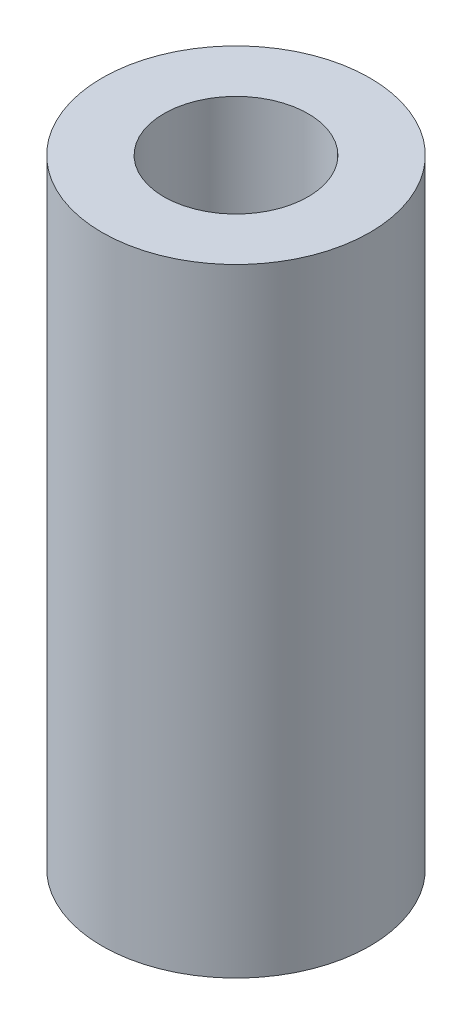
ISO-10303-21;
HEADER;
FILE_DESCRIPTION(('STEP AP214'),'2;1');
FILE_NAME('part.step','',(''),(''),'','','');
FILE_SCHEMA(('AUTOMOTIVE_DESIGN { 1 0 10303 214 1 1 1 1 }'));
ENDSEC;
DATA;
#1=APPLICATION_CONTEXT('core data for automotive mechanical design processes');
#2=APPLICATION_PROTOCOL_DEFINITION('international standard','automotive_design',2000,#1);
#3=PRODUCT_CONTEXT('',#1,'mechanical');
#4=PRODUCT('Part','Part','',(#3));
#5=PRODUCT_RELATED_PRODUCT_CATEGORY('part','',(#4));
#6=PRODUCT_DEFINITION_FORMATION('','',#4);
#7=PRODUCT_DEFINITION_CONTEXT('part definition',#1,'design');
#8=PRODUCT_DEFINITION('design','',#6,#7);
#9=PRODUCT_DEFINITION_SHAPE('','',#8);
#10=(LENGTH_UNIT() NAMED_UNIT(*) SI_UNIT(.MILLI.,.METRE.));
#11=(NAMED_UNIT(*) PLANE_ANGLE_UNIT() SI_UNIT($,.RADIAN.));
#12=(NAMED_UNIT(*) SI_UNIT($,.STERADIAN.) SOLID_ANGLE_UNIT());
#13=UNCERTAINTY_MEASURE_WITH_UNIT(LENGTH_MEASURE(1.E-05),#10,'distance_accuracy_value','');
#14=(GEOMETRIC_REPRESENTATION_CONTEXT(3) GLOBAL_UNCERTAINTY_ASSIGNED_CONTEXT((#13)) GLOBAL_UNIT_ASSIGNED_CONTEXT((#10,
#11,#12)) REPRESENTATION_CONTEXT('',''));
#15=CARTESIAN_POINT('',(0.,0.,0.));
#16=DIRECTION('',(0.,0.,1.));
#17=DIRECTION('',(1.,0.,0.));
#18=AXIS2_PLACEMENT_3D('',#15,#16,#17);
#19=CARTESIAN_POINT('',(0.,15.,0.));
#20=DIRECTION('',(0.,1.,0.));
#21=DIRECTION('',(0.,0.,1.));
#22=AXIS2_PLACEMENT_3D('',#19,#20,#21);
#23=PLANE('',#22);
#24=CARTESIAN_POINT('',(0.,15.,0.));
#25=DIRECTION('',(0.,1.,0.));
#26=DIRECTION('',(0.,0.,1.));
#27=AXIS2_PLACEMENT_3D('',#24,#25,#26);
#28=CIRCLE('',#27,3.25);
#29=CARTESIAN_POINT('',(0.,15.,3.25));
#30=VERTEX_POINT('',#29);
#31=EDGE_CURVE('E10',#30,#30,#28,.T.);
#32=ORIENTED_EDGE('',*,*,#31,.T.);
#33=EDGE_LOOP('',(#32));
#34=FACE_BOUND('',#33,.T.);
#35=CARTESIAN_POINT('',(0.,15.,0.));
#36=DIRECTION('',(0.,1.,0.));
#37=DIRECTION('',(0.,0.,1.));
#38=AXIS2_PLACEMENT_3D('',#35,#36,#37);
#39=CIRCLE('',#38,1.75);
#40=CARTESIAN_POINT('',(0.,15.,1.75));
#41=VERTEX_POINT('',#40);
#42=EDGE_CURVE('E50',#41,#41,#39,.T.);
#43=ORIENTED_EDGE('',*,*,#42,.F.);
#44=EDGE_LOOP('',(#43));
#45=FACE_BOUND('',#44,.T.);
#46=ADVANCED_FACE('F37',(#34,#45),#23,.T.);
#47=CARTESIAN_POINT('',(0.,0.,0.));
#48=DIRECTION('',(0.,1.,0.));
#49=DIRECTION('',(0.,0.,1.));
#50=AXIS2_PLACEMENT_3D('',#47,#48,#49);
#51=PLANE('',#50);
#52=CARTESIAN_POINT('',(0.,0.,0.));
#53=DIRECTION('',(0.,1.,0.));
#54=DIRECTION('',(0.,0.,1.));
#55=AXIS2_PLACEMENT_3D('',#52,#53,#54);
#56=CIRCLE('',#55,3.25);
#57=CARTESIAN_POINT('',(0.,0.,3.25));
#58=VERTEX_POINT('',#57);
#59=EDGE_CURVE('E41',#58,#58,#56,.T.);
#60=ORIENTED_EDGE('',*,*,#59,.F.);
#61=EDGE_LOOP('',(#60));
#62=FACE_BOUND('',#61,.T.);
#63=CARTESIAN_POINT('',(0.,0.,0.));
#64=DIRECTION('',(0.,1.,0.));
#65=DIRECTION('',(0.,0.,1.));
#66=AXIS2_PLACEMENT_3D('',#63,#64,#65);
#67=CIRCLE('',#66,1.75);
#68=CARTESIAN_POINT('',(0.,0.,1.75));
#69=VERTEX_POINT('',#68);
#70=EDGE_CURVE('E52',#69,#69,#67,.T.);
#71=ORIENTED_EDGE('',*,*,#70,.T.);
#72=EDGE_LOOP('',(#71));
#73=FACE_BOUND('',#72,.T.);
#74=ADVANCED_FACE('F64',(#62,#73),#51,.F.);
#75=CARTESIAN_POINT('',(0.,15.,0.));
#76=DIRECTION('',(0.,-1.,0.));
#77=DIRECTION('',(0.,0.,-1.));
#78=AXIS2_PLACEMENT_3D('',#75,#76,#77);
#79=CYLINDRICAL_SURFACE('',#78,3.25);
#80=ORIENTED_EDGE('',*,*,#31,.F.);
#81=EDGE_LOOP('',(#80));
#82=FACE_BOUND('',#81,.T.);
#83=ORIENTED_EDGE('',*,*,#59,.T.);
#84=EDGE_LOOP('',(#83));
#85=FACE_BOUND('',#84,.T.);
#86=ADVANCED_FACE('F39',(#82,#85),#79,.T.);
#87=CARTESIAN_POINT('',(0.,15.,0.));
#88=DIRECTION('',(0.,-1.,0.));
#89=DIRECTION('',(0.,0.,-1.));
#90=AXIS2_PLACEMENT_3D('',#87,#88,#89);
#91=CYLINDRICAL_SURFACE('',#90,1.75);
#92=ORIENTED_EDGE('',*,*,#42,.T.);
#93=EDGE_LOOP('',(#92));
#94=FACE_BOUND('',#93,.T.);
#95=ORIENTED_EDGE('',*,*,#70,.F.);
#96=EDGE_LOOP('',(#95));
#97=FACE_BOUND('',#96,.T.);
#98=ADVANCED_FACE('F60',(#94,#97),#91,.F.);
#99=CLOSED_SHELL('',(#46,#74,#86,#98));
#100=MANIFOLD_SOLID_BREP('B2',#99);
#101=ADVANCED_BREP_SHAPE_REPRESENTATION('',(#18,#100),#14);
#102=SHAPE_DEFINITION_REPRESENTATION(#9,#101);
ENDSEC;
END-ISO-10303-21;
